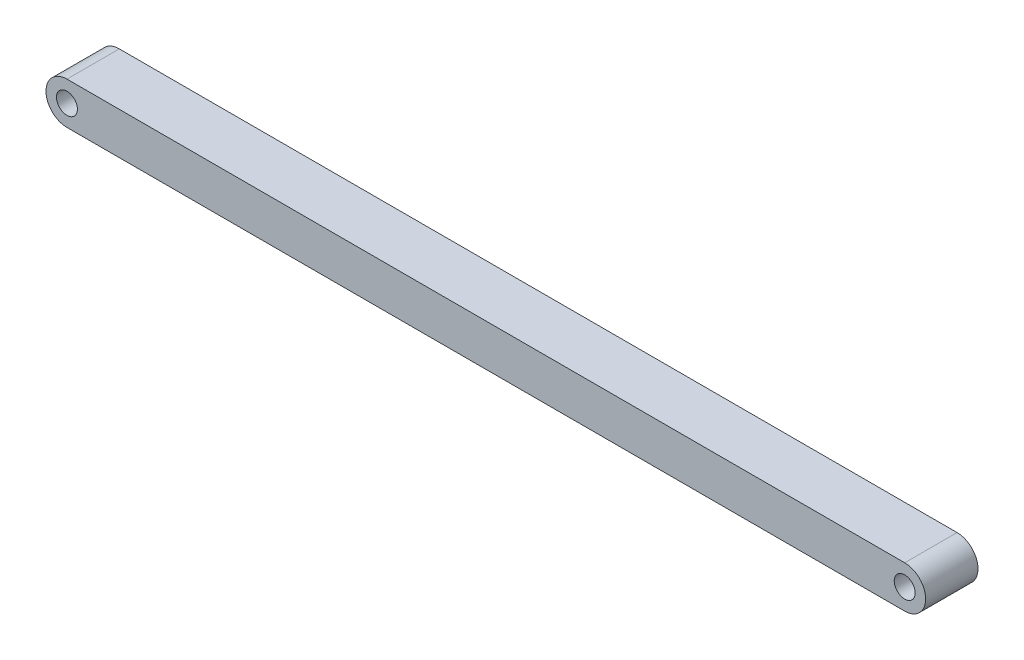
ISO-10303-21;
HEADER;
FILE_DESCRIPTION(('STEP AP214'),'2;1');
FILE_NAME('part.step','',(''),(''),'','','');
FILE_SCHEMA(('AUTOMOTIVE_DESIGN { 1 0 10303 214 1 1 1 1 }'));
ENDSEC;
DATA;
#1=APPLICATION_CONTEXT('core data for automotive mechanical design processes');
#2=APPLICATION_PROTOCOL_DEFINITION('international standard','automotive_design',2000,#1);
#3=PRODUCT_CONTEXT('',#1,'mechanical');
#4=PRODUCT('Part','Part','',(#3));
#5=PRODUCT_RELATED_PRODUCT_CATEGORY('part','',(#4));
#6=PRODUCT_DEFINITION_FORMATION('','',#4);
#7=PRODUCT_DEFINITION_CONTEXT('part definition',#1,'design');
#8=PRODUCT_DEFINITION('design','',#6,#7);
#9=PRODUCT_DEFINITION_SHAPE('','',#8);
#10=(LENGTH_UNIT() NAMED_UNIT(*) SI_UNIT(.MILLI.,.METRE.));
#11=(NAMED_UNIT(*) PLANE_ANGLE_UNIT() SI_UNIT($,.RADIAN.));
#12=(NAMED_UNIT(*) SI_UNIT($,.STERADIAN.) SOLID_ANGLE_UNIT());
#13=UNCERTAINTY_MEASURE_WITH_UNIT(LENGTH_MEASURE(1.E-05),#10,'distance_accuracy_value','');
#14=(GEOMETRIC_REPRESENTATION_CONTEXT(3) GLOBAL_UNCERTAINTY_ASSIGNED_CONTEXT((#13)) GLOBAL_UNIT_ASSIGNED_CONTEXT((#10,
#11,#12)) REPRESENTATION_CONTEXT('',''));
#15=CARTESIAN_POINT('',(0.,0.,0.));
#16=DIRECTION('',(0.,0.,1.));
#17=DIRECTION('',(1.,0.,0.));
#18=AXIS2_PLACEMENT_3D('',#15,#16,#17);
#19=CARTESIAN_POINT('',(0.,0.,5.));
#20=DIRECTION('',(0.,0.,-1.));
#21=DIRECTION('',(-1.,0.,0.));
#22=AXIS2_PLACEMENT_3D('',#19,#20,#21);
#23=CYLINDRICAL_SURFACE('',#22,2.);
#24=CARTESIAN_POINT('',(0.,0.,0.));
#25=DIRECTION('',(0.,0.,1.));
#26=DIRECTION('',(1.,0.,0.));
#27=AXIS2_PLACEMENT_3D('',#24,#25,#26);
#28=CIRCLE('',#27,2.);
#29=CARTESIAN_POINT('',(0.,2.,0.));
#30=VERTEX_POINT('',#29);
#31=CARTESIAN_POINT('',(0.,-2.,0.));
#32=VERTEX_POINT('',#31);
#33=EDGE_CURVE('E123',#30,#32,#28,.T.);
#34=ORIENTED_EDGE('',*,*,#33,.T.);
#35=DIRECTION('',(0.,0.,-1.));
#36=VECTOR('',#35,1.);
#37=CARTESIAN_POINT('',(0.,-2.,5.));
#38=LINE('',#37,#36);
#39=CARTESIAN_POINT('',(0.,-2.,5.));
#40=VERTEX_POINT('',#39);
#41=EDGE_CURVE('E11',#40,#32,#38,.T.);
#42=ORIENTED_EDGE('',*,*,#41,.F.);
#43=CARTESIAN_POINT('',(0.,0.,5.));
#44=DIRECTION('',(0.,0.,1.));
#45=DIRECTION('',(1.,0.,0.));
#46=AXIS2_PLACEMENT_3D('',#43,#44,#45);
#47=CIRCLE('',#46,2.);
#48=CARTESIAN_POINT('',(0.,2.,5.));
#49=VERTEX_POINT('',#48);
#50=EDGE_CURVE('E99',#49,#40,#47,.T.);
#51=ORIENTED_EDGE('',*,*,#50,.F.);
#52=DIRECTION('',(0.,0.,-1.));
#53=VECTOR('',#52,1.);
#54=CARTESIAN_POINT('',(0.,2.,5.));
#55=LINE('',#54,#53);
#56=EDGE_CURVE('E118',#49,#30,#55,.T.);
#57=ORIENTED_EDGE('',*,*,#56,.T.);
#58=EDGE_LOOP('',(#34,#42,#51,#57));
#59=FACE_BOUND('',#58,.T.);
#60=ADVANCED_FACE('F45',(#59),#23,.T.);
#61=CARTESIAN_POINT('',(0.,-2.,5.));
#62=DIRECTION('',(0.,1.,0.));
#63=DIRECTION('',(0.,0.,1.));
#64=AXIS2_PLACEMENT_3D('',#61,#62,#63);
#65=PLANE('',#64);
#66=DIRECTION('',(1.,0.,0.));
#67=VECTOR('',#66,1.);
#68=CARTESIAN_POINT('',(0.,-2.,0.));
#69=LINE('',#68,#67);
#70=CARTESIAN_POINT('',(80.,-2.,0.));
#71=VERTEX_POINT('',#70);
#72=EDGE_CURVE('E104',#32,#71,#69,.T.);
#73=ORIENTED_EDGE('',*,*,#72,.T.);
#74=DIRECTION('',(0.,0.,-1.));
#75=VECTOR('',#74,1.);
#76=CARTESIAN_POINT('',(80.,-2.,5.));
#77=LINE('',#76,#75);
#78=CARTESIAN_POINT('',(80.,-2.,5.));
#79=VERTEX_POINT('',#78);
#80=EDGE_CURVE('E55',#79,#71,#77,.T.);
#81=ORIENTED_EDGE('',*,*,#80,.F.);
#82=DIRECTION('',(1.,0.,0.));
#83=VECTOR('',#82,1.);
#84=CARTESIAN_POINT('',(0.,-2.,5.));
#85=LINE('',#84,#83);
#86=EDGE_CURVE('E93',#40,#79,#85,.T.);
#87=ORIENTED_EDGE('',*,*,#86,.F.);
#88=ORIENTED_EDGE('',*,*,#41,.T.);
#89=EDGE_LOOP('',(#73,#81,#87,#88));
#90=FACE_BOUND('',#89,.T.);
#91=ADVANCED_FACE('F103',(#90),#65,.F.);
#92=CARTESIAN_POINT('',(80.,0.,5.));
#93=DIRECTION('',(0.,0.,-1.));
#94=DIRECTION('',(-1.,0.,0.));
#95=AXIS2_PLACEMENT_3D('',#92,#93,#94);
#96=CYLINDRICAL_SURFACE('',#95,2.);
#97=CARTESIAN_POINT('',(80.,0.,0.));
#98=DIRECTION('',(0.,0.,1.));
#99=DIRECTION('',(1.,0.,0.));
#100=AXIS2_PLACEMENT_3D('',#97,#98,#99);
#101=CIRCLE('',#100,2.);
#102=CARTESIAN_POINT('',(80.,2.,0.));
#103=VERTEX_POINT('',#102);
#104=EDGE_CURVE('E80',#71,#103,#101,.T.);
#105=ORIENTED_EDGE('',*,*,#104,.T.);
#106=DIRECTION('',(0.,0.,-1.));
#107=VECTOR('',#106,1.);
#108=CARTESIAN_POINT('',(80.,2.,5.));
#109=LINE('',#108,#107);
#110=CARTESIAN_POINT('',(80.,2.,5.));
#111=VERTEX_POINT('',#110);
#112=EDGE_CURVE('E106',#111,#103,#109,.T.);
#113=ORIENTED_EDGE('',*,*,#112,.F.);
#114=CARTESIAN_POINT('',(80.,0.,5.));
#115=DIRECTION('',(0.,0.,1.));
#116=DIRECTION('',(1.,0.,0.));
#117=AXIS2_PLACEMENT_3D('',#114,#115,#116);
#118=CIRCLE('',#117,2.);
#119=EDGE_CURVE('E97',#79,#111,#118,.T.);
#120=ORIENTED_EDGE('',*,*,#119,.F.);
#121=ORIENTED_EDGE('',*,*,#80,.T.);
#122=EDGE_LOOP('',(#105,#113,#120,#121));
#123=FACE_BOUND('',#122,.T.);
#124=ADVANCED_FACE('F107',(#123),#96,.T.);
#125=CARTESIAN_POINT('',(0.,2.,5.));
#126=DIRECTION('',(0.,-1.,0.));
#127=DIRECTION('',(0.,0.,-1.));
#128=AXIS2_PLACEMENT_3D('',#125,#126,#127);
#129=PLANE('',#128);
#130=DIRECTION('',(-1.,0.,0.));
#131=VECTOR('',#130,1.);
#132=CARTESIAN_POINT('',(0.,2.,0.));
#133=LINE('',#132,#131);
#134=EDGE_CURVE('E86',#103,#30,#133,.T.);
#135=ORIENTED_EDGE('',*,*,#134,.T.);
#136=ORIENTED_EDGE('',*,*,#56,.F.);
#137=DIRECTION('',(-1.,0.,0.));
#138=VECTOR('',#137,1.);
#139=CARTESIAN_POINT('',(0.,2.,5.));
#140=LINE('',#139,#138);
#141=EDGE_CURVE('E63',#111,#49,#140,.T.);
#142=ORIENTED_EDGE('',*,*,#141,.F.);
#143=ORIENTED_EDGE('',*,*,#112,.T.);
#144=EDGE_LOOP('',(#135,#136,#142,#143));
#145=FACE_BOUND('',#144,.T.);
#146=ADVANCED_FACE('F141',(#145),#129,.F.);
#147=CARTESIAN_POINT('',(0.,0.,5.));
#148=DIRECTION('',(0.,0.,-1.));
#149=DIRECTION('',(-1.,0.,0.));
#150=AXIS2_PLACEMENT_3D('',#147,#148,#149);
#151=CYLINDRICAL_SURFACE('',#150,1.);
#152=CARTESIAN_POINT('',(0.,0.,5.));
#153=DIRECTION('',(0.,0.,1.));
#154=DIRECTION('',(1.,0.,0.));
#155=AXIS2_PLACEMENT_3D('',#152,#153,#154);
#156=CIRCLE('',#155,1.);
#157=CARTESIAN_POINT('',(1.,0.,5.));
#158=VERTEX_POINT('',#157);
#159=EDGE_CURVE('E137',#158,#158,#156,.T.);
#160=ORIENTED_EDGE('',*,*,#159,.T.);
#161=EDGE_LOOP('',(#160));
#162=FACE_BOUND('',#161,.T.);
#163=CARTESIAN_POINT('',(0.,0.,0.));
#164=DIRECTION('',(0.,0.,1.));
#165=DIRECTION('',(1.,0.,0.));
#166=AXIS2_PLACEMENT_3D('',#163,#164,#165);
#167=CIRCLE('',#166,1.);
#168=CARTESIAN_POINT('',(1.,0.,0.));
#169=VERTEX_POINT('',#168);
#170=EDGE_CURVE('E119',#169,#169,#167,.T.);
#171=ORIENTED_EDGE('',*,*,#170,.F.);
#172=EDGE_LOOP('',(#171));
#173=FACE_BOUND('',#172,.T.);
#174=ADVANCED_FACE('F47',(#162,#173),#151,.F.);
#175=CARTESIAN_POINT('',(80.,0.,5.));
#176=DIRECTION('',(0.,0.,-1.));
#177=DIRECTION('',(-1.,0.,0.));
#178=AXIS2_PLACEMENT_3D('',#175,#176,#177);
#179=CYLINDRICAL_SURFACE('',#178,0.999999999999998);
#180=CARTESIAN_POINT('',(80.,0.,5.));
#181=DIRECTION('',(0.,0.,1.));
#182=DIRECTION('',(1.,0.,0.));
#183=AXIS2_PLACEMENT_3D('',#180,#181,#182);
#184=CIRCLE('',#183,0.999999999999998);
#185=CARTESIAN_POINT('',(81.,0.,5.));
#186=VERTEX_POINT('',#185);
#187=EDGE_CURVE('E111',#186,#186,#184,.T.);
#188=ORIENTED_EDGE('',*,*,#187,.T.);
#189=EDGE_LOOP('',(#188));
#190=FACE_BOUND('',#189,.T.);
#191=CARTESIAN_POINT('',(80.,0.,0.));
#192=DIRECTION('',(0.,0.,1.));
#193=DIRECTION('',(1.,0.,0.));
#194=AXIS2_PLACEMENT_3D('',#191,#192,#193);
#195=CIRCLE('',#194,0.999999999999998);
#196=CARTESIAN_POINT('',(81.,0.,0.));
#197=VERTEX_POINT('',#196);
#198=EDGE_CURVE('E133',#197,#197,#195,.T.);
#199=ORIENTED_EDGE('',*,*,#198,.F.);
#200=EDGE_LOOP('',(#199));
#201=FACE_BOUND('',#200,.T.);
#202=ADVANCED_FACE('F156',(#190,#201),#179,.F.);
#203=CARTESIAN_POINT('',(0.,0.,5.));
#204=DIRECTION('',(0.,0.,1.));
#205=DIRECTION('',(1.,0.,0.));
#206=AXIS2_PLACEMENT_3D('',#203,#204,#205);
#207=PLANE('',#206);
#208=ORIENTED_EDGE('',*,*,#159,.F.);
#209=EDGE_LOOP('',(#208));
#210=FACE_BOUND('',#209,.T.);
#211=ORIENTED_EDGE('',*,*,#50,.T.);
#212=ORIENTED_EDGE('',*,*,#86,.T.);
#213=ORIENTED_EDGE('',*,*,#119,.T.);
#214=ORIENTED_EDGE('',*,*,#141,.T.);
#215=EDGE_LOOP('',(#211,#212,#213,#214));
#216=FACE_BOUND('',#215,.T.);
#217=ORIENTED_EDGE('',*,*,#187,.F.);
#218=EDGE_LOOP('',(#217));
#219=FACE_BOUND('',#218,.T.);
#220=ADVANCED_FACE('F94',(#210,#216,#219),#207,.T.);
#221=CARTESIAN_POINT('',(0.,0.,0.));
#222=DIRECTION('',(0.,0.,1.));
#223=DIRECTION('',(1.,0.,0.));
#224=AXIS2_PLACEMENT_3D('',#221,#222,#223);
#225=PLANE('',#224);
#226=ORIENTED_EDGE('',*,*,#170,.T.);
#227=EDGE_LOOP('',(#226));
#228=FACE_BOUND('',#227,.T.);
#229=ORIENTED_EDGE('',*,*,#33,.F.);
#230=ORIENTED_EDGE('',*,*,#134,.F.);
#231=ORIENTED_EDGE('',*,*,#104,.F.);
#232=ORIENTED_EDGE('',*,*,#72,.F.);
#233=EDGE_LOOP('',(#229,#230,#231,#232));
#234=FACE_BOUND('',#233,.T.);
#235=ORIENTED_EDGE('',*,*,#198,.T.);
#236=EDGE_LOOP('',(#235));
#237=FACE_BOUND('',#236,.T.);
#238=ADVANCED_FACE('F144',(#228,#234,#237),#225,.F.);
#239=CLOSED_SHELL('',(#60,#91,#124,#146,#174,#202,#220,#238));
#240=MANIFOLD_SOLID_BREP('B2',#239);
#241=ADVANCED_BREP_SHAPE_REPRESENTATION('',(#18,#240),#14);
#242=SHAPE_DEFINITION_REPRESENTATION(#9,#241);
ENDSEC;
END-ISO-10303-21;
